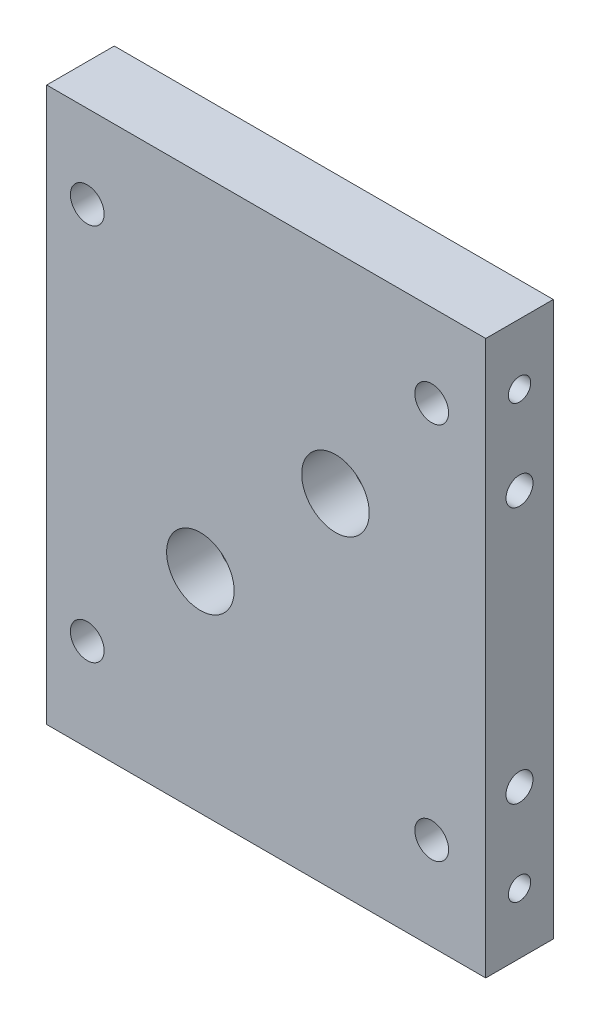
ISO-10303-21;
HEADER;
FILE_DESCRIPTION(('STEP AP214'),'2;1');
FILE_NAME('part.step','',(''),(''),'','','');
FILE_SCHEMA(('AUTOMOTIVE_DESIGN { 1 0 10303 214 1 1 1 1 }'));
ENDSEC;
DATA;
#1=APPLICATION_CONTEXT('core data for automotive mechanical design processes');
#2=APPLICATION_PROTOCOL_DEFINITION('international standard','automotive_design',2000,#1);
#3=PRODUCT_CONTEXT('',#1,'mechanical');
#4=PRODUCT('Part','Part','',(#3));
#5=PRODUCT_RELATED_PRODUCT_CATEGORY('part','',(#4));
#6=PRODUCT_DEFINITION_FORMATION('','',#4);
#7=PRODUCT_DEFINITION_CONTEXT('part definition',#1,'design');
#8=PRODUCT_DEFINITION('design','',#6,#7);
#9=PRODUCT_DEFINITION_SHAPE('','',#8);
#10=(LENGTH_UNIT() NAMED_UNIT(*) SI_UNIT(.MILLI.,.METRE.));
#11=(NAMED_UNIT(*) PLANE_ANGLE_UNIT() SI_UNIT($,.RADIAN.));
#12=(NAMED_UNIT(*) SI_UNIT($,.STERADIAN.) SOLID_ANGLE_UNIT());
#13=UNCERTAINTY_MEASURE_WITH_UNIT(LENGTH_MEASURE(1.E-05),#10,'distance_accuracy_value','');
#14=(GEOMETRIC_REPRESENTATION_CONTEXT(3) GLOBAL_UNCERTAINTY_ASSIGNED_CONTEXT((#13)) GLOBAL_UNIT_ASSIGNED_CONTEXT((#10,
#11,#12)) REPRESENTATION_CONTEXT('',''));
#15=CARTESIAN_POINT('',(0.,0.,0.));
#16=DIRECTION('',(0.,0.,1.));
#17=DIRECTION('',(1.,0.,0.));
#18=AXIS2_PLACEMENT_3D('',#15,#16,#17);
#19=CARTESIAN_POINT('',(-32.5,41.,10.));
#20=DIRECTION('',(1.,0.,0.));
#21=DIRECTION('',(0.,0.,-1.));
#22=AXIS2_PLACEMENT_3D('',#19,#20,#21);
#23=PLANE('',#22);
#24=DIRECTION('',(0.,-1.,0.));
#25=VECTOR('',#24,1.);
#26=CARTESIAN_POINT('',(-32.5,41.,0.));
#27=LINE('',#26,#25);
#28=CARTESIAN_POINT('',(-32.5,41.,0.));
#29=VERTEX_POINT('',#28);
#30=CARTESIAN_POINT('',(-32.5,-41.,0.));
#31=VERTEX_POINT('',#30);
#32=EDGE_CURVE('E160',#29,#31,#27,.T.);
#33=ORIENTED_EDGE('',*,*,#32,.T.);
#34=DIRECTION('',(0.,0.,-1.));
#35=VECTOR('',#34,1.);
#36=CARTESIAN_POINT('',(-32.5,-41.,10.));
#37=LINE('',#36,#35);
#38=CARTESIAN_POINT('',(-32.5,-41.,10.));
#39=VERTEX_POINT('',#38);
#40=EDGE_CURVE('E11',#39,#31,#37,.T.);
#41=ORIENTED_EDGE('',*,*,#40,.F.);
#42=DIRECTION('',(0.,-1.,0.));
#43=VECTOR('',#42,1.);
#44=CARTESIAN_POINT('',(-32.5,41.,10.));
#45=LINE('',#44,#43);
#46=CARTESIAN_POINT('',(-32.5,41.,10.));
#47=VERTEX_POINT('',#46);
#48=EDGE_CURVE('E161',#47,#39,#45,.T.);
#49=ORIENTED_EDGE('',*,*,#48,.F.);
#50=DIRECTION('',(0.,0.,-1.));
#51=VECTOR('',#50,1.);
#52=CARTESIAN_POINT('',(-32.5,41.,10.));
#53=LINE('',#52,#51);
#54=EDGE_CURVE('E167',#47,#29,#53,.T.);
#55=ORIENTED_EDGE('',*,*,#54,.T.);
#56=EDGE_LOOP('',(#33,#41,#49,#55));
#57=FACE_BOUND('',#56,.T.);
#58=ADVANCED_FACE('F36',(#57),#23,.F.);
#59=CARTESIAN_POINT('',(32.5,-41.,10.));
#60=DIRECTION('',(0.,1.,0.));
#61=DIRECTION('',(-1.,0.,0.));
#62=AXIS2_PLACEMENT_3D('',#59,#60,#61);
#63=PLANE('',#62);
#64=DIRECTION('',(1.,0.,0.));
#65=VECTOR('',#64,1.);
#66=CARTESIAN_POINT('',(32.5,-41.,0.));
#67=LINE('',#66,#65);
#68=CARTESIAN_POINT('',(32.5,-41.,0.));
#69=VERTEX_POINT('',#68);
#70=EDGE_CURVE('E170',#31,#69,#67,.T.);
#71=ORIENTED_EDGE('',*,*,#70,.T.);
#72=DIRECTION('',(0.,0.,-1.));
#73=VECTOR('',#72,1.);
#74=CARTESIAN_POINT('',(32.5,-41.,10.));
#75=LINE('',#74,#73);
#76=CARTESIAN_POINT('',(32.5,-41.,10.));
#77=VERTEX_POINT('',#76);
#78=EDGE_CURVE('E49',#77,#69,#75,.T.);
#79=ORIENTED_EDGE('',*,*,#78,.F.);
#80=DIRECTION('',(1.,0.,0.));
#81=VECTOR('',#80,1.);
#82=CARTESIAN_POINT('',(32.5,-41.,10.));
#83=LINE('',#82,#81);
#84=EDGE_CURVE('E88',#39,#77,#83,.T.);
#85=ORIENTED_EDGE('',*,*,#84,.F.);
#86=ORIENTED_EDGE('',*,*,#40,.T.);
#87=EDGE_LOOP('',(#71,#79,#85,#86));
#88=FACE_BOUND('',#87,.T.);
#89=ADVANCED_FACE('F195',(#88),#63,.F.);
#90=CARTESIAN_POINT('',(32.5,41.,10.));
#91=DIRECTION('',(-1.,0.,0.));
#92=DIRECTION('',(0.,-1.,0.));
#93=AXIS2_PLACEMENT_3D('',#90,#91,#92);
#94=PLANE('',#93);
#95=CARTESIAN_POINT('',(32.5,-19.,5.));
#96=DIRECTION('',(1.,0.,0.));
#97=DIRECTION('',(0.,0.,-1.));
#98=AXIS2_PLACEMENT_3D('',#95,#96,#97);
#99=CIRCLE('',#98,1.99999999999999);
#100=CARTESIAN_POINT('',(32.5,-19.,3.00000000000001));
#101=VERTEX_POINT('',#100);
#102=EDGE_CURVE('E112',#101,#101,#99,.T.);
#103=ORIENTED_EDGE('',*,*,#102,.F.);
#104=EDGE_LOOP('',(#103));
#105=FACE_BOUND('',#104,.T.);
#106=CARTESIAN_POINT('',(32.5,19.,5.));
#107=DIRECTION('',(1.,0.,0.));
#108=DIRECTION('',(0.,0.,-1.));
#109=AXIS2_PLACEMENT_3D('',#106,#107,#108);
#110=CIRCLE('',#109,1.99999999999999);
#111=CARTESIAN_POINT('',(32.5,19.,3.00000000000001));
#112=VERTEX_POINT('',#111);
#113=EDGE_CURVE('E111',#112,#112,#110,.T.);
#114=ORIENTED_EDGE('',*,*,#113,.F.);
#115=EDGE_LOOP('',(#114));
#116=FACE_BOUND('',#115,.T.);
#117=CARTESIAN_POINT('',(32.5,-31.9999999999997,5.00000000000001));
#118=DIRECTION('',(1.,0.,0.));
#119=DIRECTION('',(0.,0.,-1.));
#120=AXIS2_PLACEMENT_3D('',#117,#118,#119);
#121=CIRCLE('',#120,1.64999999999999);
#122=CARTESIAN_POINT('',(32.5,-31.9999999999997,3.35000000000002));
#123=VERTEX_POINT('',#122);
#124=EDGE_CURVE('E124',#123,#123,#121,.T.);
#125=ORIENTED_EDGE('',*,*,#124,.F.);
#126=EDGE_LOOP('',(#125));
#127=FACE_BOUND('',#126,.T.);
#128=CARTESIAN_POINT('',(32.5,32.0000000000003,4.99999999999999));
#129=DIRECTION('',(1.,0.,0.));
#130=DIRECTION('',(0.,0.,-1.));
#131=AXIS2_PLACEMENT_3D('',#128,#129,#130);
#132=CIRCLE('',#131,1.64999999999999);
#133=CARTESIAN_POINT('',(32.5,32.0000000000003,3.35));
#134=VERTEX_POINT('',#133);
#135=EDGE_CURVE('E130',#134,#134,#132,.T.);
#136=ORIENTED_EDGE('',*,*,#135,.F.);
#137=EDGE_LOOP('',(#136));
#138=FACE_BOUND('',#137,.T.);
#139=DIRECTION('',(0.,1.,0.));
#140=VECTOR('',#139,1.);
#141=CARTESIAN_POINT('',(32.5,41.,0.));
#142=LINE('',#141,#140);
#143=CARTESIAN_POINT('',(32.5,41.,0.));
#144=VERTEX_POINT('',#143);
#145=EDGE_CURVE('E75',#69,#144,#142,.T.);
#146=ORIENTED_EDGE('',*,*,#145,.T.);
#147=DIRECTION('',(0.,0.,-1.));
#148=VECTOR('',#147,1.);
#149=CARTESIAN_POINT('',(32.5,41.,10.));
#150=LINE('',#149,#148);
#151=CARTESIAN_POINT('',(32.5,41.,10.));
#152=VERTEX_POINT('',#151);
#153=EDGE_CURVE('E175',#152,#144,#150,.T.);
#154=ORIENTED_EDGE('',*,*,#153,.F.);
#155=DIRECTION('',(0.,1.,0.));
#156=VECTOR('',#155,1.);
#157=CARTESIAN_POINT('',(32.5,41.,10.));
#158=LINE('',#157,#156);
#159=EDGE_CURVE('E164',#77,#152,#158,.T.);
#160=ORIENTED_EDGE('',*,*,#159,.F.);
#161=ORIENTED_EDGE('',*,*,#78,.T.);
#162=EDGE_LOOP('',(#146,#154,#160,#161));
#163=FACE_BOUND('',#162,.T.);
#164=ADVANCED_FACE('F178',(#105,#116,#127,#138,#163),#94,.F.);
#165=CARTESIAN_POINT('',(32.5,41.,10.));
#166=DIRECTION('',(0.,-1.,0.));
#167=DIRECTION('',(1.,0.,0.));
#168=AXIS2_PLACEMENT_3D('',#165,#166,#167);
#169=PLANE('',#168);
#170=DIRECTION('',(-1.,0.,0.));
#171=VECTOR('',#170,1.);
#172=CARTESIAN_POINT('',(32.5,41.,0.));
#173=LINE('',#172,#171);
#174=EDGE_CURVE('E81',#144,#29,#173,.T.);
#175=ORIENTED_EDGE('',*,*,#174,.T.);
#176=ORIENTED_EDGE('',*,*,#54,.F.);
#177=DIRECTION('',(-1.,0.,0.));
#178=VECTOR('',#177,1.);
#179=CARTESIAN_POINT('',(32.5,41.,10.));
#180=LINE('',#179,#178);
#181=EDGE_CURVE('E57',#152,#47,#180,.T.);
#182=ORIENTED_EDGE('',*,*,#181,.F.);
#183=ORIENTED_EDGE('',*,*,#153,.T.);
#184=EDGE_LOOP('',(#175,#176,#182,#183));
#185=FACE_BOUND('',#184,.T.);
#186=ADVANCED_FACE('F185',(#185),#169,.F.);
#187=CARTESIAN_POINT('',(0.,0.,10.));
#188=DIRECTION('',(0.,0.,-1.));
#189=DIRECTION('',(-1.,0.,0.));
#190=AXIS2_PLACEMENT_3D('',#187,#188,#189);
#191=PLANE('',#190);
#192=CARTESIAN_POINT('',(-26.5000000000022,28.6999999999854,10.));
#193=DIRECTION('',(0.,0.,-1.));
#194=DIRECTION('',(-1.,0.,0.));
#195=AXIS2_PLACEMENT_3D('',#192,#193,#194);
#196=CIRCLE('',#195,2.5);
#197=CARTESIAN_POINT('',(-29.0000000000022,28.6999999999854,10.));
#198=VERTEX_POINT('',#197);
#199=EDGE_CURVE('E452',#198,#198,#196,.T.);
#200=ORIENTED_EDGE('',*,*,#199,.T.);
#201=EDGE_LOOP('',(#200));
#202=FACE_BOUND('',#201,.T.);
#203=CARTESIAN_POINT('',(24.4999999999978,28.6999999999855,10.));
#204=DIRECTION('',(0.,0.,-1.));
#205=DIRECTION('',(-1.,0.,0.));
#206=AXIS2_PLACEMENT_3D('',#203,#204,#205);
#207=CIRCLE('',#206,2.5);
#208=CARTESIAN_POINT('',(21.9999999999978,28.6999999999855,10.));
#209=VERTEX_POINT('',#208);
#210=EDGE_CURVE('E462',#209,#209,#207,.T.);
#211=ORIENTED_EDGE('',*,*,#210,.T.);
#212=EDGE_LOOP('',(#211));
#213=FACE_BOUND('',#212,.T.);
#214=CARTESIAN_POINT('',(24.4999999999978,-27.3000000000145,10.));
#215=DIRECTION('',(0.,0.,-1.));
#216=DIRECTION('',(-1.,0.,0.));
#217=AXIS2_PLACEMENT_3D('',#214,#215,#216);
#218=CIRCLE('',#217,2.5);
#219=CARTESIAN_POINT('',(21.9999999999978,-27.3000000000145,10.));
#220=VERTEX_POINT('',#219);
#221=EDGE_CURVE('E468',#220,#220,#218,.T.);
#222=ORIENTED_EDGE('',*,*,#221,.T.);
#223=EDGE_LOOP('',(#222));
#224=FACE_BOUND('',#223,.T.);
#225=CARTESIAN_POINT('',(-26.5000000000022,-27.3000000000146,10.));
#226=DIRECTION('',(0.,0.,-1.));
#227=DIRECTION('',(-1.,0.,0.));
#228=AXIS2_PLACEMENT_3D('',#225,#226,#227);
#229=CIRCLE('',#228,2.5);
#230=CARTESIAN_POINT('',(-29.0000000000022,-27.3000000000146,10.));
#231=VERTEX_POINT('',#230);
#232=EDGE_CURVE('E118',#231,#231,#229,.T.);
#233=ORIENTED_EDGE('',*,*,#232,.T.);
#234=EDGE_LOOP('',(#233));
#235=FACE_BOUND('',#234,.T.);
#236=CARTESIAN_POINT('',(10.2500000000008,9.9999999999736,10.));
#237=DIRECTION('',(0.,0.,1.));
#238=DIRECTION('',(1.,0.,0.));
#239=AXIS2_PLACEMENT_3D('',#236,#237,#238);
#240=CIRCLE('',#239,4.99999999999999);
#241=CARTESIAN_POINT('',(15.2500000000008,9.9999999999736,10.));
#242=VERTEX_POINT('',#241);
#243=EDGE_CURVE('E136',#242,#242,#240,.T.);
#244=ORIENTED_EDGE('',*,*,#243,.F.);
#245=EDGE_LOOP('',(#244));
#246=FACE_BOUND('',#245,.T.);
#247=CARTESIAN_POINT('',(-9.74999999999904,-10.0000000000264,10.));
#248=DIRECTION('',(0.,0.,1.));
#249=DIRECTION('',(1.,0.,0.));
#250=AXIS2_PLACEMENT_3D('',#247,#248,#249);
#251=CIRCLE('',#250,4.99999999999999);
#252=CARTESIAN_POINT('',(-4.74999999999904,-10.0000000000264,10.));
#253=VERTEX_POINT('',#252);
#254=EDGE_CURVE('E148',#253,#253,#251,.T.);
#255=ORIENTED_EDGE('',*,*,#254,.F.);
#256=EDGE_LOOP('',(#255));
#257=FACE_BOUND('',#256,.T.);
#258=ORIENTED_EDGE('',*,*,#48,.T.);
#259=ORIENTED_EDGE('',*,*,#84,.T.);
#260=ORIENTED_EDGE('',*,*,#159,.T.);
#261=ORIENTED_EDGE('',*,*,#181,.T.);
#262=EDGE_LOOP('',(#258,#259,#260,#261));
#263=FACE_BOUND('',#262,.T.);
#264=ADVANCED_FACE('F187',(#202,#213,#224,#235,#246,#257,#263),#191,.F.);
#265=CARTESIAN_POINT('',(0.,0.,0.));
#266=DIRECTION('',(0.,0.,-1.));
#267=DIRECTION('',(-1.,0.,0.));
#268=AXIS2_PLACEMENT_3D('',#265,#266,#267);
#269=PLANE('',#268);
#270=CARTESIAN_POINT('',(-26.5000000000022,28.6999999999854,0.));
#271=DIRECTION('',(0.,0.,-1.));
#272=DIRECTION('',(-1.,0.,0.));
#273=AXIS2_PLACEMENT_3D('',#270,#271,#272);
#274=CIRCLE('',#273,2.49999999999999);
#275=CARTESIAN_POINT('',(-29.0000000000022,28.6999999999854,0.));
#276=VERTEX_POINT('',#275);
#277=EDGE_CURVE('E455',#276,#276,#274,.T.);
#278=ORIENTED_EDGE('',*,*,#277,.F.);
#279=EDGE_LOOP('',(#278));
#280=FACE_BOUND('',#279,.T.);
#281=CARTESIAN_POINT('',(24.4999999999978,28.6999999999855,0.));
#282=DIRECTION('',(0.,0.,-1.));
#283=DIRECTION('',(-1.,0.,0.));
#284=AXIS2_PLACEMENT_3D('',#281,#282,#283);
#285=CIRCLE('',#284,2.49999999999999);
#286=CARTESIAN_POINT('',(21.9999999999978,28.6999999999855,0.));
#287=VERTEX_POINT('',#286);
#288=EDGE_CURVE('E457',#287,#287,#285,.T.);
#289=ORIENTED_EDGE('',*,*,#288,.F.);
#290=EDGE_LOOP('',(#289));
#291=FACE_BOUND('',#290,.T.);
#292=CARTESIAN_POINT('',(24.4999999999978,-27.3000000000145,0.));
#293=DIRECTION('',(0.,0.,-1.));
#294=DIRECTION('',(-1.,0.,0.));
#295=AXIS2_PLACEMENT_3D('',#292,#293,#294);
#296=CIRCLE('',#295,2.49999999999999);
#297=CARTESIAN_POINT('',(21.9999999999978,-27.3000000000145,0.));
#298=VERTEX_POINT('',#297);
#299=EDGE_CURVE('E465',#298,#298,#296,.T.);
#300=ORIENTED_EDGE('',*,*,#299,.F.);
#301=EDGE_LOOP('',(#300));
#302=FACE_BOUND('',#301,.T.);
#303=CARTESIAN_POINT('',(-26.5000000000022,-27.3000000000146,0.));
#304=DIRECTION('',(0.,0.,-1.));
#305=DIRECTION('',(-1.,0.,0.));
#306=AXIS2_PLACEMENT_3D('',#303,#304,#305);
#307=CIRCLE('',#306,2.49999999999999);
#308=CARTESIAN_POINT('',(-29.0000000000022,-27.3000000000146,0.));
#309=VERTEX_POINT('',#308);
#310=EDGE_CURVE('E471',#309,#309,#307,.T.);
#311=ORIENTED_EDGE('',*,*,#310,.F.);
#312=EDGE_LOOP('',(#311));
#313=FACE_BOUND('',#312,.T.);
#314=CARTESIAN_POINT('',(10.2500000000008,9.9999999999736,0.));
#315=DIRECTION('',(0.,0.,1.));
#316=DIRECTION('',(1.,0.,0.));
#317=AXIS2_PLACEMENT_3D('',#314,#315,#316);
#318=CIRCLE('',#317,2.75);
#319=CARTESIAN_POINT('',(13.0000000000008,9.9999999999736,0.));
#320=VERTEX_POINT('',#319);
#321=EDGE_CURVE('E145',#320,#320,#318,.T.);
#322=ORIENTED_EDGE('',*,*,#321,.T.);
#323=EDGE_LOOP('',(#322));
#324=FACE_BOUND('',#323,.T.);
#325=CARTESIAN_POINT('',(-9.74999999999904,-10.0000000000264,0.));
#326=DIRECTION('',(0.,0.,1.));
#327=DIRECTION('',(1.,0.,0.));
#328=AXIS2_PLACEMENT_3D('',#325,#326,#327);
#329=CIRCLE('',#328,2.75);
#330=CARTESIAN_POINT('',(-6.99999999999904,-10.0000000000264,0.));
#331=VERTEX_POINT('',#330);
#332=EDGE_CURVE('E157',#331,#331,#329,.T.);
#333=ORIENTED_EDGE('',*,*,#332,.T.);
#334=EDGE_LOOP('',(#333));
#335=FACE_BOUND('',#334,.T.);
#336=ORIENTED_EDGE('',*,*,#32,.F.);
#337=ORIENTED_EDGE('',*,*,#174,.F.);
#338=ORIENTED_EDGE('',*,*,#145,.F.);
#339=ORIENTED_EDGE('',*,*,#70,.F.);
#340=EDGE_LOOP('',(#336,#337,#338,#339));
#341=FACE_BOUND('',#340,.T.);
#342=ADVANCED_FACE('F181',(#280,#291,#302,#313,#324,#335,#341),#269,.T.);
#343=CARTESIAN_POINT('',(-9.74999999999904,-10.0000000000264,10.));
#344=DIRECTION('',(0.,0.,1.));
#345=DIRECTION('',(1.,0.,0.));
#346=AXIS2_PLACEMENT_3D('',#343,#344,#345);
#347=CYLINDRICAL_SURFACE('',#346,2.75);
#348=ORIENTED_EDGE('',*,*,#332,.F.);
#349=EDGE_LOOP('',(#348));
#350=FACE_BOUND('',#349,.T.);
#351=CARTESIAN_POINT('',(-9.74999999999904,-10.0000000000264,3.));
#352=DIRECTION('',(0.,0.,1.));
#353=DIRECTION('',(1.,0.,0.));
#354=AXIS2_PLACEMENT_3D('',#351,#352,#353);
#355=CIRCLE('',#354,2.75000000000001);
#356=CARTESIAN_POINT('',(-6.99999999999903,-10.0000000000264,3.));
#357=VERTEX_POINT('',#356);
#358=EDGE_CURVE('E154',#357,#357,#355,.T.);
#359=ORIENTED_EDGE('',*,*,#358,.T.);
#360=EDGE_LOOP('',(#359));
#361=FACE_BOUND('',#360,.T.);
#362=ADVANCED_FACE('F268',(#350,#361),#347,.F.);
#363=CARTESIAN_POINT('',(-6.99999999999903,-10.0000000000264,3.));
#364=DIRECTION('',(0.,0.,-1.));
#365=DIRECTION('',(-1.,0.,0.));
#366=AXIS2_PLACEMENT_3D('',#363,#364,#365);
#367=PLANE('',#366);
#368=ORIENTED_EDGE('',*,*,#358,.F.);
#369=EDGE_LOOP('',(#368));
#370=FACE_BOUND('',#369,.T.);
#371=CARTESIAN_POINT('',(-9.74999999999904,-10.0000000000264,3.));
#372=DIRECTION('',(0.,0.,1.));
#373=DIRECTION('',(1.,0.,0.));
#374=AXIS2_PLACEMENT_3D('',#371,#372,#373);
#375=CIRCLE('',#374,4.99999999999999);
#376=CARTESIAN_POINT('',(-4.74999999999905,-10.0000000000264,3.));
#377=VERTEX_POINT('',#376);
#378=EDGE_CURVE('E151',#377,#377,#375,.T.);
#379=ORIENTED_EDGE('',*,*,#378,.T.);
#380=EDGE_LOOP('',(#379));
#381=FACE_BOUND('',#380,.T.);
#382=ADVANCED_FACE('F389',(#370,#381),#367,.F.);
#383=CARTESIAN_POINT('',(-9.74999999999904,-10.0000000000264,10.));
#384=DIRECTION('',(0.,0.,1.));
#385=DIRECTION('',(1.,0.,0.));
#386=AXIS2_PLACEMENT_3D('',#383,#384,#385);
#387=CYLINDRICAL_SURFACE('',#386,4.99999999999999);
#388=ORIENTED_EDGE('',*,*,#378,.F.);
#389=EDGE_LOOP('',(#388));
#390=FACE_BOUND('',#389,.T.);
#391=ORIENTED_EDGE('',*,*,#254,.T.);
#392=EDGE_LOOP('',(#391));
#393=FACE_BOUND('',#392,.T.);
#394=ADVANCED_FACE('F379',(#390,#393),#387,.F.);
#395=CARTESIAN_POINT('',(10.2500000000008,9.9999999999736,10.));
#396=DIRECTION('',(0.,0.,1.));
#397=DIRECTION('',(1.,0.,0.));
#398=AXIS2_PLACEMENT_3D('',#395,#396,#397);
#399=CYLINDRICAL_SURFACE('',#398,2.75);
#400=ORIENTED_EDGE('',*,*,#321,.F.);
#401=EDGE_LOOP('',(#400));
#402=FACE_BOUND('',#401,.T.);
#403=CARTESIAN_POINT('',(10.2500000000008,9.9999999999736,3.));
#404=DIRECTION('',(0.,0.,1.));
#405=DIRECTION('',(1.,0.,0.));
#406=AXIS2_PLACEMENT_3D('',#403,#404,#405);
#407=CIRCLE('',#406,2.75000000000001);
#408=CARTESIAN_POINT('',(13.0000000000008,9.9999999999736,3.));
#409=VERTEX_POINT('',#408);
#410=EDGE_CURVE('E142',#409,#409,#407,.T.);
#411=ORIENTED_EDGE('',*,*,#410,.T.);
#412=EDGE_LOOP('',(#411));
#413=FACE_BOUND('',#412,.T.);
#414=ADVANCED_FACE('F369',(#402,#413),#399,.F.);
#415=CARTESIAN_POINT('',(13.0000000000008,9.9999999999736,3.));
#416=DIRECTION('',(0.,0.,-1.));
#417=DIRECTION('',(-1.,0.,0.));
#418=AXIS2_PLACEMENT_3D('',#415,#416,#417);
#419=PLANE('',#418);
#420=ORIENTED_EDGE('',*,*,#410,.F.);
#421=EDGE_LOOP('',(#420));
#422=FACE_BOUND('',#421,.T.);
#423=CARTESIAN_POINT('',(10.2500000000008,9.9999999999736,3.));
#424=DIRECTION('',(0.,0.,1.));
#425=DIRECTION('',(1.,0.,0.));
#426=AXIS2_PLACEMENT_3D('',#423,#424,#425);
#427=CIRCLE('',#426,4.99999999999999);
#428=CARTESIAN_POINT('',(15.2500000000007,9.9999999999736,3.));
#429=VERTEX_POINT('',#428);
#430=EDGE_CURVE('E139',#429,#429,#427,.T.);
#431=ORIENTED_EDGE('',*,*,#430,.T.);
#432=EDGE_LOOP('',(#431));
#433=FACE_BOUND('',#432,.T.);
#434=ADVANCED_FACE('F359',(#422,#433),#419,.F.);
#435=CARTESIAN_POINT('',(10.2500000000008,9.9999999999736,10.));
#436=DIRECTION('',(0.,0.,1.));
#437=DIRECTION('',(1.,0.,0.));
#438=AXIS2_PLACEMENT_3D('',#435,#436,#437);
#439=CYLINDRICAL_SURFACE('',#438,4.99999999999999);
#440=ORIENTED_EDGE('',*,*,#430,.F.);
#441=EDGE_LOOP('',(#440));
#442=FACE_BOUND('',#441,.T.);
#443=ORIENTED_EDGE('',*,*,#243,.T.);
#444=EDGE_LOOP('',(#443));
#445=FACE_BOUND('',#444,.T.);
#446=ADVANCED_FACE('F351',(#442,#445),#439,.F.);
#447=CARTESIAN_POINT('',(21.,32.0000000000003,4.99999999999999));
#448=DIRECTION('',(1.,0.,0.));
#449=DIRECTION('',(0.,0.,-1.));
#450=AXIS2_PLACEMENT_3D('',#447,#448,#449);
#451=CONICAL_SURFACE('',#450,1.64999999999998,1.02974425867665);
#452=CARTESIAN_POINT('',(20.0085799786045,32.0000000000003,4.99999999999999));
#453=VERTEX_POINT('',#452);
#454=VERTEX_LOOP('',#453);
#455=FACE_BOUND('',#454,.T.);
#456=CARTESIAN_POINT('',(21.,32.0000000000003,4.99999999999999));
#457=DIRECTION('',(1.,0.,0.));
#458=DIRECTION('',(0.,0.,-1.));
#459=AXIS2_PLACEMENT_3D('',#456,#457,#458);
#460=CIRCLE('',#459,1.64999999999998);
#461=CARTESIAN_POINT('',(21.,32.0000000000003,3.35000000000001));
#462=VERTEX_POINT('',#461);
#463=EDGE_CURVE('E133',#462,#462,#460,.T.);
#464=ORIENTED_EDGE('',*,*,#463,.T.);
#465=EDGE_LOOP('',(#464));
#466=FACE_BOUND('',#465,.T.);
#467=ADVANCED_FACE('F282',(#455,#466),#451,.F.);
#468=CARTESIAN_POINT('',(32.5,32.0000000000003,4.99999999999999));
#469=DIRECTION('',(1.,0.,0.));
#470=DIRECTION('',(0.,0.,-1.));
#471=AXIS2_PLACEMENT_3D('',#468,#469,#470);
#472=CYLINDRICAL_SURFACE('',#471,1.64999999999999);
#473=CARTESIAN_POINT('',(22.6218360029116,30.3500000000003,4.99999999999999));
#474=CARTESIAN_POINT('',(22.6218360125059,30.350004349701,4.92952038976779));
#475=CARTESIAN_POINT('',(22.6258010528758,30.3545475663921,4.8589688644248));
#476=CARTESIAN_POINT('',(22.6417543386646,30.3724416470048,4.71984183333738));
#477=CARTESIAN_POINT('',(22.6537554521326,30.3858066366154,4.65126968112709));
#478=CARTESIAN_POINT('',(22.6859586075155,30.4204092758737,4.51822251400282));
#479=CARTESIAN_POINT('',(22.7061528078113,30.4416393961065,4.45374364944713));
#480=CARTESIAN_POINT('',(22.7548430612384,30.4904208787928,4.33063065069069));
#481=CARTESIAN_POINT('',(22.7833348260451,30.5179689744486,4.27199351833815));
#482=CARTESIAN_POINT('',(22.8485408100732,30.5773981579807,4.16176641926291));
#483=CARTESIAN_POINT('',(22.885271182114,30.6092877088791,4.11019062150022));
#484=CARTESIAN_POINT('',(22.9663911724248,30.6750359218422,4.01494888743481));
#485=CARTESIAN_POINT('',(23.0107828916306,30.708895122342,3.97128512756421));
#486=CARTESIAN_POINT('',(23.1097477373303,30.7787291795616,3.8890927371875));
#487=CARTESIAN_POINT('',(23.1648209309267,30.8146828890225,3.85115164401081));
#488=CARTESIAN_POINT('',(23.2814091175639,30.8839516668918,3.78374432041711));
#489=CARTESIAN_POINT('',(23.3429277094723,30.9172652427199,3.75428285947745));
#490=CARTESIAN_POINT('',(23.4814939046432,30.9846222454214,3.698567808729));
#491=CARTESIAN_POINT('',(23.5594375615964,31.017897992801,3.67362180685645));
#492=CARTESIAN_POINT('',(23.7202347839563,31.0768301984827,3.6319507331142));
#493=CARTESIAN_POINT('',(23.8030916179009,31.1024815147733,3.61523120432276));
#494=CARTESIAN_POINT('',(23.9894423394432,31.1495639214169,3.58571787145573));
#495=CARTESIAN_POINT('',(24.0936722378982,31.1690380816541,3.57444156311466));
#496=CARTESIAN_POINT('',(24.3043956149836,31.1945974513772,3.55984537670685));
#497=CARTESIAN_POINT('',(24.4108910130167,31.200670810788,3.55653254035673));
#498=CARTESIAN_POINT('',(24.5775180164989,31.1995266503794,3.55718032393417));
#499=CARTESIAN_POINT('',(24.637737528368,31.196929048144,3.55861065321698));
#500=CARTESIAN_POINT('',(24.7577173563283,31.1874079625744,3.5639541862662));
#501=CARTESIAN_POINT('',(24.8174778022778,31.1804857518842,3.56786665959343));
#502=CARTESIAN_POINT('',(24.9361222835291,31.1623966976848,3.57837066211052));
#503=CARTESIAN_POINT('',(24.9950062608616,31.1512295747038,3.58496236769466));
#504=CARTESIAN_POINT('',(25.1114102667521,31.1248182578256,3.60114550118553));
#505=CARTESIAN_POINT('',(25.1689305921284,31.1095749602026,3.61073626973315));
#506=CARTESIAN_POINT('',(25.3186078180145,31.0641714836728,3.64062970054551));
#507=CARTESIAN_POINT('',(25.4092390623206,31.0307238946389,3.66385418681189));
#508=CARTESIAN_POINT('',(25.5828242030067,30.9553075090973,3.72196706294341));
#509=CARTESIAN_POINT('',(25.6657903977433,30.913352720345,3.7568363390568));
#510=CARTESIAN_POINT('',(25.8069647460128,30.8324201826701,3.83306183591158));
#511=CARTESIAN_POINT('',(25.8669261434485,30.7943004978297,3.87206657085145));
#512=CARTESIAN_POINT('',(25.9781590889814,30.7173281364304,3.96044456953779));
#513=CARTESIAN_POINT('',(26.0294349563673,30.6784758349462,4.00981265210717));
#514=CARTESIAN_POINT('',(26.1222371658017,30.6031427853532,4.11925102993608));
#515=CARTESIAN_POINT('',(26.1637029188095,30.5666777326022,4.17938400107031));
#516=CARTESIAN_POINT('',(26.2357139892442,30.4999235105948,4.30893754779709));
#517=CARTESIAN_POINT('',(26.2662619108175,30.4696328693451,4.37835590318231));
#518=CARTESIAN_POINT('',(26.3136541494396,30.4209565349104,4.516369624205));
#519=CARTESIAN_POINT('',(26.331614665077,30.4016440701098,4.58425895217413));
#520=CARTESIAN_POINT('',(26.3589361419447,30.3717569943468,4.72359994157898));
#521=CARTESIAN_POINT('',(26.368298506815,30.361180957199,4.79505101955375));
#522=CARTESIAN_POINT('',(26.3784066673462,30.3497404392435,4.93667940652747));
#523=CARTESIAN_POINT('',(26.3794540260044,30.3485361047906,5.00680825007207));
#524=CARTESIAN_POINT('',(26.3737477902677,30.3550189696696,5.14632846467043));
#525=CARTESIAN_POINT('',(26.3669951752622,30.3627050526924,5.21571992720812));
#526=CARTESIAN_POINT('',(26.345593403735,30.3864270829484,5.35160552043078));
#527=CARTESIAN_POINT('',(26.3309656156109,30.4024404310937,5.41810696757388));
#528=CARTESIAN_POINT('',(26.2936578617402,30.4417001944703,5.54654406200953));
#529=CARTESIAN_POINT('',(26.2709790337528,30.4649455876239,5.60848035294942));
#530=CARTESIAN_POINT('',(26.217365407852,30.5171561716315,5.72654412957033));
#531=CARTESIAN_POINT('',(26.1863830698229,30.5461540406162,5.78263549873911));
#532=CARTESIAN_POINT('',(26.1164873101538,30.607650329861,5.88744546916943));
#533=CARTESIAN_POINT('',(26.0775732076212,30.6401490505346,5.93616343684425));
#534=CARTESIAN_POINT('',(25.9905095821043,30.7078723918468,6.02776543390839));
#535=CARTESIAN_POINT('',(25.9420200738879,30.7431537466992,6.07028255534011));
#536=CARTESIAN_POINT('',(25.8381450731214,30.8126472302094,6.14689834440077));
#537=CARTESIAN_POINT('',(25.7827562812587,30.8468588374434,6.180992960867));
#538=CARTESIAN_POINT('',(25.6586316569735,30.9165917158331,6.24550304438103));
#539=CARTESIAN_POINT('',(25.5890992505462,30.9516889094052,6.27483740335496));
#540=CARTESIAN_POINT('',(25.4445468882032,31.0160548887678,6.32515004625602));
#541=CARTESIAN_POINT('',(25.3695232856785,31.0453197525021,6.34612271663305));
#542=CARTESIAN_POINT('',(25.1998969183799,31.1020152899298,6.38475190492595));
#543=CARTESIAN_POINT('',(25.1044150184343,31.127862881142,6.40086687041138));
#544=CARTESIAN_POINT('',(24.9100497608388,31.1681417376116,6.4251550234783));
#545=CARTESIAN_POINT('',(24.8111641643802,31.1825653329043,6.43332287628126));
#546=CARTESIAN_POINT('',(24.6534894160432,31.1959688087456,6.4408519859373));
#547=CARTESIAN_POINT('',(24.5951016307057,31.1988746205904,6.44246179329452));
#548=CARTESIAN_POINT('',(24.4782512669031,31.200587285861,6.44341377742067));
#549=CARTESIAN_POINT('',(24.4197887096952,31.1993951206306,6.4427564970896));
#550=CARTESIAN_POINT('',(24.3030805857576,31.1929188300401,6.43914314805584));
#551=CARTESIAN_POINT('',(24.2448354427085,31.1876289213917,6.43618383038262));
#552=CARTESIAN_POINT('',(24.1290528223882,31.1730145949316,6.42781866949975));
#553=CARTESIAN_POINT('',(24.0715150688165,31.1636918073753,6.42241381483609));
#554=CARTESIAN_POINT('',(23.9548774192961,31.1406017820617,6.4085895739655));
#555=CARTESIAN_POINT('',(23.8958293475414,31.1266479857198,6.40004166368823));
#556=CARTESIAN_POINT('',(23.7794289228157,31.0946650459713,6.37957569647124));
#557=CARTESIAN_POINT('',(23.7220768422899,31.0766352517717,6.3676571012758));
#558=CARTESIAN_POINT('',(23.6097498664916,31.0368770157301,6.33995513799798));
#559=CARTESIAN_POINT('',(23.5547705438911,31.0151558721346,6.32417936952258));
#560=CARTESIAN_POINT('',(23.4477373126875,30.9685135240167,6.28817797573876));
#561=CARTESIAN_POINT('',(23.3956818914232,30.9435939964922,6.26795467845167));
#562=CARTESIAN_POINT('',(23.276836104194,30.8817013520949,6.21414519338345));
#563=CARTESIAN_POINT('',(23.2115672722787,30.8436392940228,6.1783737149268));
#564=CARTESIAN_POINT('',(23.0895932997446,30.7654301680256,6.09614847429237));
#565=CARTESIAN_POINT('',(23.0328799309421,30.7252851539757,6.04970508568766));
#566=CARTESIAN_POINT('',(22.9292323391347,30.6460167015323,5.94527514326228));
#567=CARTESIAN_POINT('',(22.8823699853786,30.6069024766874,5.88720940787115));
#568=CARTESIAN_POINT('',(22.8000611922507,30.5339179026651,5.76054418268266));
#569=CARTESIAN_POINT('',(22.7646152690683,30.5000477906342,5.69194421679126));
#570=CARTESIAN_POINT('',(22.7090447136365,30.4446593740317,5.55516045245424));
#571=CARTESIAN_POINT('',(22.6875933013922,30.4221474215226,5.48791137158634));
#572=CARTESIAN_POINT('',(22.6536883540319,30.3857522305453,5.34904468637669));
#573=CARTESIAN_POINT('',(22.6412174311449,30.3718523250025,5.27743581662502));
#574=CARTESIAN_POINT('',(22.6293546357743,30.3585268213871,5.17099011144227));
#575=CARTESIAN_POINT('',(22.6265347105017,30.3553355871245,5.13693697983891));
#576=CARTESIAN_POINT('',(22.6227754119853,30.351071140629,5.0685949082778));
#577=CARTESIAN_POINT('',(22.6218359982415,30.3499978827821,5.03430597341442));
#578=CARTESIAN_POINT('',(22.6218360029116,30.3500000000003,4.99999999999999));
#579=B_SPLINE_CURVE_WITH_KNOTS('',3,(#473,#474,#475,#476,#477,#478,#479,#480,#481,#482,#483,
#484,#485,#486,#487,#488,#489,#490,#491,#492,#493,#494,#495,#496,#497,#498,#499,#500,#501,#502,
#503,#504,#505,#506,#507,#508,#509,#510,#511,#512,#513,#514,#515,#516,#517,#518,#519,#520,#521,
#522,#523,#524,#525,#526,#527,#528,#529,#530,#531,#532,#533,#534,#535,#536,#537,#538,#539,#540,
#541,#542,#543,#544,#545,#546,#547,#548,#549,#550,#551,#552,#553,#554,#555,#556,#557,#558,#559,
#560,#561,#562,#563,#564,#565,#566,#567,#568,#569,#570,#571,#572,#573,#574,#575,#576,#577,#578),
.UNSPECIFIED.,.T.,.F.,(4,2,2,2,2,2,2,2,2,2,2,2,2,2,2,2,2,2,2,2,2,2,2,2,2,2,2,2,2,2,2,2,2,2,2,2,
2,2,2,2,2,2,2,2,2,2,2,2,2,2,2,2,4),(0.,0.211307776772636,0.422954729408589,0.634399590416537,
0.84573536641197,1.05748917181733,1.26930113802376,1.49620466124592,1.72323556095332,
1.98730692163055,2.25155597333674,2.57022289369745,2.88917149245639,3.06987014872486,
3.25051565409206,3.43117305465683,3.61179076467428,3.90861566181307,4.20495572595429,
4.44711733666413,4.68915816529476,4.93265698185227,5.17609767968773,5.39350190414747,
5.61087063125948,5.82031824326203,6.02973955921184,6.23859547696841,6.44742189130478,
6.65747043195537,6.86753701156695,7.08717400332049,7.3069164340438,7.55568904641196,
7.80462839011292,8.10418886149209,8.40395028490504,8.57923350660271,8.7544747561023,
8.92996378131201,9.10538193284231,9.28895947277145,9.47256634427879,9.65581433838863,
9.8389666402264,10.0886907339454,10.3381731039469,10.5894168591165,10.8406719725795,
11.0618263316285,11.2825513380448,11.3854076829546,11.4882618126574),.UNSPECIFIED.);
#580=CARTESIAN_POINT('',(22.6218360029116,30.3500000000003,4.99999999999999));
#581=VERTEX_POINT('',#580);
#582=EDGE_CURVE('E39',#581,#581,#579,.T.);
#583=ORIENTED_EDGE('',*,*,#582,.T.);
#584=EDGE_LOOP('',(#583));
#585=FACE_BOUND('',#584,.T.);
#586=ORIENTED_EDGE('',*,*,#463,.F.);
#587=EDGE_LOOP('',(#586));
#588=FACE_BOUND('',#587,.T.);
#589=ORIENTED_EDGE('',*,*,#135,.T.);
#590=EDGE_LOOP('',(#589));
#591=FACE_BOUND('',#590,.T.);
#592=ADVANCED_FACE('F275',(#585,#588,#591),#472,.F.);
#593=CARTESIAN_POINT('',(21.,-31.9999999999997,5.00000000000001));
#594=DIRECTION('',(1.,0.,0.));
#595=DIRECTION('',(0.,0.,-1.));
#596=AXIS2_PLACEMENT_3D('',#593,#594,#595);
#597=CONICAL_SURFACE('',#596,1.64999999999999,1.02974425867665);
#598=CARTESIAN_POINT('',(20.0085799786045,-31.9999999999997,5.00000000000001));
#599=VERTEX_POINT('',#598);
#600=VERTEX_LOOP('',#599);
#601=FACE_BOUND('',#600,.T.);
#602=CARTESIAN_POINT('',(21.,-31.9999999999997,5.00000000000001));
#603=DIRECTION('',(1.,0.,0.));
#604=DIRECTION('',(0.,0.,-1.));
#605=AXIS2_PLACEMENT_3D('',#602,#603,#604);
#606=CIRCLE('',#605,1.64999999999999);
#607=CARTESIAN_POINT('',(21.,-31.9999999999997,3.35000000000002));
#608=VERTEX_POINT('',#607);
#609=EDGE_CURVE('E127',#608,#608,#606,.T.);
#610=ORIENTED_EDGE('',*,*,#609,.T.);
#611=EDGE_LOOP('',(#610));
#612=FACE_BOUND('',#611,.T.);
#613=ADVANCED_FACE('F281',(#601,#612),#597,.F.);
#614=CARTESIAN_POINT('',(32.5,-31.9999999999997,5.00000000000001));
#615=DIRECTION('',(1.,0.,0.));
#616=DIRECTION('',(0.,0.,-1.));
#617=AXIS2_PLACEMENT_3D('',#614,#615,#616);
#618=CYLINDRICAL_SURFACE('',#617,1.64999999999999);
#619=ORIENTED_EDGE('',*,*,#609,.F.);
#620=EDGE_LOOP('',(#619));
#621=FACE_BOUND('',#620,.T.);
#622=ORIENTED_EDGE('',*,*,#124,.T.);
#623=EDGE_LOOP('',(#622));
#624=FACE_BOUND('',#623,.T.);
#625=ADVANCED_FACE('F216',(#621,#624),#618,.F.);
#626=CARTESIAN_POINT('',(24.5,19.,5.));
#627=DIRECTION('',(1.,0.,0.));
#628=DIRECTION('',(0.,0.,-1.));
#629=AXIS2_PLACEMENT_3D('',#626,#627,#628);
#630=CONICAL_SURFACE('',#629,1.99999999999999,1.0471975511966);
#631=CARTESIAN_POINT('',(23.3452994616208,19.,5.));
#632=VERTEX_POINT('',#631);
#633=VERTEX_LOOP('',#632);
#634=FACE_BOUND('',#633,.T.);
#635=CARTESIAN_POINT('',(24.5,19.,5.));
#636=DIRECTION('',(1.,0.,0.));
#637=DIRECTION('',(0.,0.,-1.));
#638=AXIS2_PLACEMENT_3D('',#635,#636,#637);
#639=CIRCLE('',#638,1.99999999999999);
#640=CARTESIAN_POINT('',(24.5,19.,3.00000000000001));
#641=VERTEX_POINT('',#640);
#642=EDGE_CURVE('E115',#641,#641,#639,.T.);
#643=ORIENTED_EDGE('',*,*,#642,.T.);
#644=EDGE_LOOP('',(#643));
#645=FACE_BOUND('',#644,.T.);
#646=ADVANCED_FACE('F221',(#634,#645),#630,.F.);
#647=CARTESIAN_POINT('',(32.5,19.,5.));
#648=DIRECTION('',(1.,0.,0.));
#649=DIRECTION('',(0.,0.,-1.));
#650=AXIS2_PLACEMENT_3D('',#647,#648,#649);
#651=CYLINDRICAL_SURFACE('',#650,1.99999999999999);
#652=ORIENTED_EDGE('',*,*,#642,.F.);
#653=EDGE_LOOP('',(#652));
#654=FACE_BOUND('',#653,.T.);
#655=ORIENTED_EDGE('',*,*,#113,.T.);
#656=EDGE_LOOP('',(#655));
#657=FACE_BOUND('',#656,.T.);
#658=ADVANCED_FACE('F105',(#654,#657),#651,.F.);
#659=CARTESIAN_POINT('',(24.5,-19.,5.));
#660=DIRECTION('',(1.,0.,0.));
#661=DIRECTION('',(0.,0.,-1.));
#662=AXIS2_PLACEMENT_3D('',#659,#660,#661);
#663=CONICAL_SURFACE('',#662,1.99999999999999,1.0471975511966);
#664=CARTESIAN_POINT('',(23.3452994616208,-19.,5.));
#665=VERTEX_POINT('',#664);
#666=VERTEX_LOOP('',#665);
#667=FACE_BOUND('',#666,.T.);
#668=CARTESIAN_POINT('',(24.5,-19.,5.));
#669=DIRECTION('',(1.,0.,0.));
#670=DIRECTION('',(0.,0.,-1.));
#671=AXIS2_PLACEMENT_3D('',#668,#669,#670);
#672=CIRCLE('',#671,1.99999999999999);
#673=CARTESIAN_POINT('',(24.5,-19.,3.00000000000002));
#674=VERTEX_POINT('',#673);
#675=EDGE_CURVE('E109',#674,#674,#672,.T.);
#676=ORIENTED_EDGE('',*,*,#675,.T.);
#677=EDGE_LOOP('',(#676));
#678=FACE_BOUND('',#677,.T.);
#679=ADVANCED_FACE('F101',(#667,#678),#663,.F.);
#680=CARTESIAN_POINT('',(32.5,-19.,5.));
#681=DIRECTION('',(1.,0.,0.));
#682=DIRECTION('',(0.,0.,-1.));
#683=AXIS2_PLACEMENT_3D('',#680,#681,#682);
#684=CYLINDRICAL_SURFACE('',#683,1.99999999999999);
#685=ORIENTED_EDGE('',*,*,#675,.F.);
#686=EDGE_LOOP('',(#685));
#687=FACE_BOUND('',#686,.T.);
#688=ORIENTED_EDGE('',*,*,#102,.T.);
#689=EDGE_LOOP('',(#688));
#690=FACE_BOUND('',#689,.T.);
#691=ADVANCED_FACE('F104',(#687,#690),#684,.F.);
#692=CARTESIAN_POINT('',(-26.5000000000022,-27.3000000000146,0.));
#693=DIRECTION('',(0.,0.,-1.));
#694=DIRECTION('',(-1.,0.,0.));
#695=AXIS2_PLACEMENT_3D('',#692,#693,#694);
#696=CYLINDRICAL_SURFACE('',#695,2.49999999999999);
#697=ORIENTED_EDGE('',*,*,#232,.F.);
#698=EDGE_LOOP('',(#697));
#699=FACE_BOUND('',#698,.T.);
#700=ORIENTED_EDGE('',*,*,#310,.T.);
#701=EDGE_LOOP('',(#700));
#702=FACE_BOUND('',#701,.T.);
#703=ADVANCED_FACE('F251',(#699,#702),#696,.F.);
#704=CARTESIAN_POINT('',(24.4999999999978,-27.3000000000145,0.));
#705=DIRECTION('',(0.,0.,-1.));
#706=DIRECTION('',(-1.,0.,0.));
#707=AXIS2_PLACEMENT_3D('',#704,#705,#706);
#708=CYLINDRICAL_SURFACE('',#707,2.49999999999999);
#709=ORIENTED_EDGE('',*,*,#221,.F.);
#710=EDGE_LOOP('',(#709));
#711=FACE_BOUND('',#710,.T.);
#712=ORIENTED_EDGE('',*,*,#299,.T.);
#713=EDGE_LOOP('',(#712));
#714=FACE_BOUND('',#713,.T.);
#715=ADVANCED_FACE('F293',(#711,#714),#708,.F.);
#716=CARTESIAN_POINT('',(24.4999999999978,28.6999999999855,0.));
#717=DIRECTION('',(0.,0.,-1.));
#718=DIRECTION('',(-1.,0.,0.));
#719=AXIS2_PLACEMENT_3D('',#716,#717,#718);
#720=CYLINDRICAL_SURFACE('',#719,2.49999999999999);
#721=ORIENTED_EDGE('',*,*,#288,.T.);
#722=EDGE_LOOP('',(#721));
#723=FACE_BOUND('',#722,.T.);
#724=ORIENTED_EDGE('',*,*,#210,.F.);
#725=EDGE_LOOP('',(#724));
#726=FACE_BOUND('',#725,.T.);
#727=ORIENTED_EDGE('',*,*,#582,.F.);
#728=EDGE_LOOP('',(#727));
#729=FACE_BOUND('',#728,.T.);
#730=ADVANCED_FACE('F304',(#723,#726,#729),#720,.F.);
#731=CARTESIAN_POINT('',(-26.5000000000022,28.6999999999854,0.));
#732=DIRECTION('',(0.,0.,-1.));
#733=DIRECTION('',(-1.,0.,0.));
#734=AXIS2_PLACEMENT_3D('',#731,#732,#733);
#735=CYLINDRICAL_SURFACE('',#734,2.49999999999999);
#736=ORIENTED_EDGE('',*,*,#199,.F.);
#737=EDGE_LOOP('',(#736));
#738=FACE_BOUND('',#737,.T.);
#739=ORIENTED_EDGE('',*,*,#277,.T.);
#740=EDGE_LOOP('',(#739));
#741=FACE_BOUND('',#740,.T.);
#742=ADVANCED_FACE('F315',(#738,#741),#735,.F.);
#743=CLOSED_SHELL('',(#58,#89,#164,#186,#264,#342,#362,#382,#394,#414,#434,#446,#467,#592,#613,
#625,#646,#658,#679,#691,#703,#715,#730,#742));
#744=MANIFOLD_SOLID_BREP('B2',#743);
#745=ADVANCED_BREP_SHAPE_REPRESENTATION('',(#18,#744),#14);
#746=SHAPE_DEFINITION_REPRESENTATION(#9,#745);
ENDSEC;
END-ISO-10303-21;
